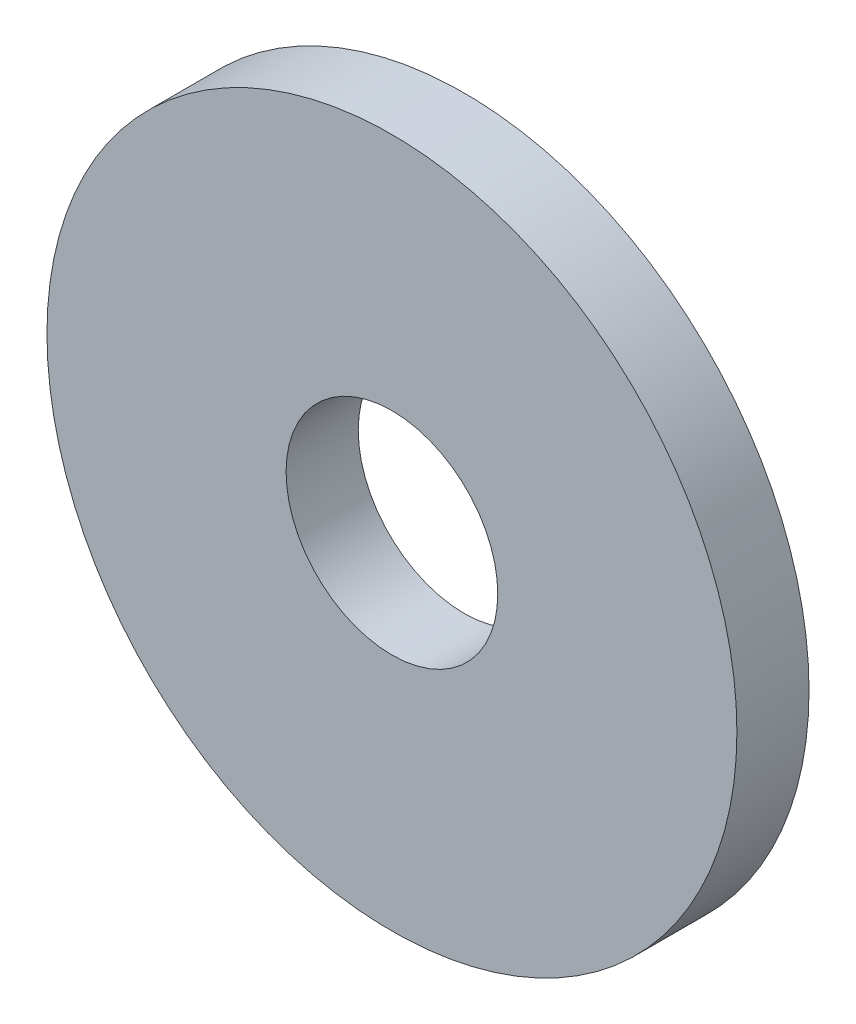
ISO-10303-21;
HEADER;
FILE_DESCRIPTION(('STEP AP214'),'2;1');
FILE_NAME('part.step','',(''),(''),'','','');
FILE_SCHEMA(('AUTOMOTIVE_DESIGN { 1 0 10303 214 1 1 1 1 }'));
ENDSEC;
DATA;
#1=APPLICATION_CONTEXT('core data for automotive mechanical design processes');
#2=APPLICATION_PROTOCOL_DEFINITION('international standard','automotive_design',2000,#1);
#3=PRODUCT_CONTEXT('',#1,'mechanical');
#4=PRODUCT('Part','Part','',(#3));
#5=PRODUCT_RELATED_PRODUCT_CATEGORY('part','',(#4));
#6=PRODUCT_DEFINITION_FORMATION('','',#4);
#7=PRODUCT_DEFINITION_CONTEXT('part definition',#1,'design');
#8=PRODUCT_DEFINITION('design','',#6,#7);
#9=PRODUCT_DEFINITION_SHAPE('','',#8);
#10=(LENGTH_UNIT() NAMED_UNIT(*) SI_UNIT(.MILLI.,.METRE.));
#11=(NAMED_UNIT(*) PLANE_ANGLE_UNIT() SI_UNIT($,.RADIAN.));
#12=(NAMED_UNIT(*) SI_UNIT($,.STERADIAN.) SOLID_ANGLE_UNIT());
#13=UNCERTAINTY_MEASURE_WITH_UNIT(LENGTH_MEASURE(1.E-05),#10,'distance_accuracy_value','');
#14=(GEOMETRIC_REPRESENTATION_CONTEXT(3) GLOBAL_UNCERTAINTY_ASSIGNED_CONTEXT((#13)) GLOBAL_UNIT_ASSIGNED_CONTEXT((#10,
#11,#12)) REPRESENTATION_CONTEXT('',''));
#15=CARTESIAN_POINT('',(0.,0.,0.));
#16=DIRECTION('',(0.,0.,1.));
#17=DIRECTION('',(1.,0.,0.));
#18=AXIS2_PLACEMENT_3D('',#15,#16,#17);
#19=CARTESIAN_POINT('',(0.,0.,4.6));
#20=DIRECTION('',(0.,0.,1.));
#21=DIRECTION('',(1.,0.,0.));
#22=AXIS2_PLACEMENT_3D('',#19,#20,#21);
#23=PLANE('',#22);
#24=CARTESIAN_POINT('',(0.,0.,4.6));
#25=DIRECTION('',(0.,0.,1.));
#26=DIRECTION('',(1.,0.,0.));
#27=AXIS2_PLACEMENT_3D('',#24,#25,#26);
#28=CIRCLE('',#27,22.);
#29=CARTESIAN_POINT('',(22.,0.,4.6));
#30=VERTEX_POINT('',#29);
#31=EDGE_CURVE('E10',#30,#30,#28,.T.);
#32=ORIENTED_EDGE('',*,*,#31,.T.);
#33=EDGE_LOOP('',(#32));
#34=FACE_BOUND('',#33,.T.);
#35=CARTESIAN_POINT('',(0.,0.,4.6));
#36=DIRECTION('',(0.,0.,1.));
#37=DIRECTION('',(1.,0.,0.));
#38=AXIS2_PLACEMENT_3D('',#35,#36,#37);
#39=CIRCLE('',#38,6.75);
#40=CARTESIAN_POINT('',(6.75,0.,4.6));
#41=VERTEX_POINT('',#40);
#42=EDGE_CURVE('E43',#41,#41,#39,.T.);
#43=ORIENTED_EDGE('',*,*,#42,.F.);
#44=EDGE_LOOP('',(#43));
#45=FACE_BOUND('',#44,.T.);
#46=ADVANCED_FACE('F32',(#34,#45),#23,.T.);
#47=CARTESIAN_POINT('',(0.,0.,0.));
#48=DIRECTION('',(0.,0.,1.));
#49=DIRECTION('',(1.,0.,0.));
#50=AXIS2_PLACEMENT_3D('',#47,#48,#49);
#51=PLANE('',#50);
#52=CARTESIAN_POINT('',(0.,0.,0.));
#53=DIRECTION('',(0.,0.,1.));
#54=DIRECTION('',(1.,0.,0.));
#55=AXIS2_PLACEMENT_3D('',#52,#53,#54);
#56=CIRCLE('',#55,22.);
#57=CARTESIAN_POINT('',(22.,0.,0.));
#58=VERTEX_POINT('',#57);
#59=EDGE_CURVE('E36',#58,#58,#56,.T.);
#60=ORIENTED_EDGE('',*,*,#59,.F.);
#61=EDGE_LOOP('',(#60));
#62=FACE_BOUND('',#61,.T.);
#63=CARTESIAN_POINT('',(0.,0.,0.));
#64=DIRECTION('',(0.,0.,1.));
#65=DIRECTION('',(1.,0.,0.));
#66=AXIS2_PLACEMENT_3D('',#63,#64,#65);
#67=CIRCLE('',#66,6.75);
#68=CARTESIAN_POINT('',(6.75,0.,0.));
#69=VERTEX_POINT('',#68);
#70=EDGE_CURVE('E45',#69,#69,#67,.T.);
#71=ORIENTED_EDGE('',*,*,#70,.T.);
#72=EDGE_LOOP('',(#71));
#73=FACE_BOUND('',#72,.T.);
#74=ADVANCED_FACE('F55',(#62,#73),#51,.F.);
#75=CARTESIAN_POINT('',(0.,0.,4.6));
#76=DIRECTION('',(0.,0.,-1.));
#77=DIRECTION('',(-1.,0.,0.));
#78=AXIS2_PLACEMENT_3D('',#75,#76,#77);
#79=CYLINDRICAL_SURFACE('',#78,22.);
#80=ORIENTED_EDGE('',*,*,#31,.F.);
#81=EDGE_LOOP('',(#80));
#82=FACE_BOUND('',#81,.T.);
#83=ORIENTED_EDGE('',*,*,#59,.T.);
#84=EDGE_LOOP('',(#83));
#85=FACE_BOUND('',#84,.T.);
#86=ADVANCED_FACE('F34',(#82,#85),#79,.T.);
#87=CARTESIAN_POINT('',(0.,0.,4.6));
#88=DIRECTION('',(0.,0.,-1.));
#89=DIRECTION('',(-1.,0.,0.));
#90=AXIS2_PLACEMENT_3D('',#87,#88,#89);
#91=CYLINDRICAL_SURFACE('',#90,6.75);
#92=ORIENTED_EDGE('',*,*,#42,.T.);
#93=EDGE_LOOP('',(#92));
#94=FACE_BOUND('',#93,.T.);
#95=ORIENTED_EDGE('',*,*,#70,.F.);
#96=EDGE_LOOP('',(#95));
#97=FACE_BOUND('',#96,.T.);
#98=ADVANCED_FACE('F51',(#94,#97),#91,.F.);
#99=CLOSED_SHELL('',(#46,#74,#86,#98));
#100=MANIFOLD_SOLID_BREP('B2',#99);
#101=ADVANCED_BREP_SHAPE_REPRESENTATION('',(#18,#100),#14);
#102=SHAPE_DEFINITION_REPRESENTATION(#9,#101);
ENDSEC;
END-ISO-10303-21;
